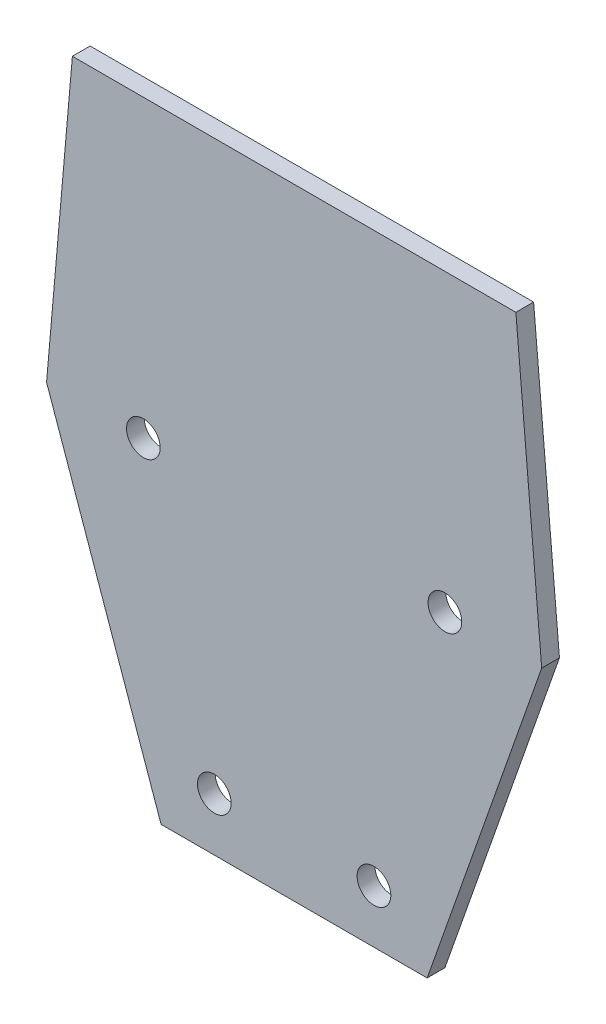
ISO-10303-21;
HEADER;
FILE_DESCRIPTION(('STEP AP214'),'2;1');
FILE_NAME('part.step','',(''),(''),'','','');
FILE_SCHEMA(('AUTOMOTIVE_DESIGN { 1 0 10303 214 1 1 1 1 }'));
ENDSEC;
DATA;
#1=APPLICATION_CONTEXT('core data for automotive mechanical design processes');
#2=APPLICATION_PROTOCOL_DEFINITION('international standard','automotive_design',2000,#1);
#3=PRODUCT_CONTEXT('',#1,'mechanical');
#4=PRODUCT('Part','Part','',(#3));
#5=PRODUCT_RELATED_PRODUCT_CATEGORY('part','',(#4));
#6=PRODUCT_DEFINITION_FORMATION('','',#4);
#7=PRODUCT_DEFINITION_CONTEXT('part definition',#1,'design');
#8=PRODUCT_DEFINITION('design','',#6,#7);
#9=PRODUCT_DEFINITION_SHAPE('','',#8);
#10=(LENGTH_UNIT() NAMED_UNIT(*) SI_UNIT(.MILLI.,.METRE.));
#11=(NAMED_UNIT(*) PLANE_ANGLE_UNIT() SI_UNIT($,.RADIAN.));
#12=(NAMED_UNIT(*) SI_UNIT($,.STERADIAN.) SOLID_ANGLE_UNIT());
#13=UNCERTAINTY_MEASURE_WITH_UNIT(LENGTH_MEASURE(1.E-05),#10,'distance_accuracy_value','');
#14=(GEOMETRIC_REPRESENTATION_CONTEXT(3) GLOBAL_UNCERTAINTY_ASSIGNED_CONTEXT((#13)) GLOBAL_UNIT_ASSIGNED_CONTEXT((#10,
#11,#12)) REPRESENTATION_CONTEXT('',''));
#15=CARTESIAN_POINT('',(0.,0.,0.));
#16=DIRECTION('',(0.,0.,1.));
#17=DIRECTION('',(1.,0.,0.));
#18=AXIS2_PLACEMENT_3D('',#15,#16,#17);
#19=CARTESIAN_POINT('',(-31.75,28.792017295859,2.54));
#20=DIRECTION('',(0.996194698091745,-0.087155742747662,0.));
#21=DIRECTION('',(0.087155742747662,0.996194698091745,0.));
#22=AXIS2_PLACEMENT_3D('',#19,#20,#21);
#23=PLANE('',#22);
#24=DIRECTION('',(-0.087155742747662,-0.996194698091745,0.));
#25=VECTOR('',#24,1.);
#26=CARTESIAN_POINT('',(-31.75,28.792017295859,0.));
#27=LINE('',#26,#25);
#28=CARTESIAN_POINT('',(-31.75,28.792017295859,0.));
#29=VERTEX_POINT('',#28);
#30=CARTESIAN_POINT('',(-35.4482854595529,-13.4795789373709,0.));
#31=VERTEX_POINT('',#30);
#32=EDGE_CURVE('E128',#29,#31,#27,.T.);
#33=ORIENTED_EDGE('',*,*,#32,.T.);
#34=DIRECTION('',(0.,0.,-1.));
#35=VECTOR('',#34,1.);
#36=CARTESIAN_POINT('',(-35.4482854595529,-13.4795789373709,2.54));
#37=LINE('',#36,#35);
#38=CARTESIAN_POINT('',(-35.4482854595529,-13.4795789373709,2.54));
#39=VERTEX_POINT('',#38);
#40=EDGE_CURVE('E11',#39,#31,#37,.T.);
#41=ORIENTED_EDGE('',*,*,#40,.F.);
#42=DIRECTION('',(-0.087155742747662,-0.996194698091745,0.));
#43=VECTOR('',#42,1.);
#44=CARTESIAN_POINT('',(-31.75,28.792017295859,2.54));
#45=LINE('',#44,#43);
#46=CARTESIAN_POINT('',(-31.75,28.792017295859,2.54));
#47=VERTEX_POINT('',#46);
#48=EDGE_CURVE('E149',#47,#39,#45,.T.);
#49=ORIENTED_EDGE('',*,*,#48,.F.);
#50=DIRECTION('',(0.,0.,-1.));
#51=VECTOR('',#50,1.);
#52=CARTESIAN_POINT('',(-31.75,28.792017295859,2.54));
#53=LINE('',#52,#51);
#54=EDGE_CURVE('E56',#47,#29,#53,.T.);
#55=ORIENTED_EDGE('',*,*,#54,.T.);
#56=EDGE_LOOP('',(#33,#41,#49,#55));
#57=FACE_BOUND('',#56,.T.);
#58=ADVANCED_FACE('F39',(#57),#23,.F.);
#59=CARTESIAN_POINT('',(-35.4482854595529,-13.4795789373709,2.54));
#60=DIRECTION('',(0.943363084419856,0.331762099935866,0.));
#61=DIRECTION('',(-0.331762099935867,0.943363084419856,0.));
#62=AXIS2_PLACEMENT_3D('',#59,#60,#61);
#63=PLANE('',#62);
#64=DIRECTION('',(0.331762099935866,-0.943363084419856,0.));
#65=VECTOR('',#64,1.);
#66=CARTESIAN_POINT('',(-35.4482854595529,-13.4795789373709,0.));
#67=LINE('',#66,#65);
#68=CARTESIAN_POINT('',(-19.05,-60.107982704141,0.));
#69=VERTEX_POINT('',#68);
#70=EDGE_CURVE('E131',#31,#69,#67,.T.);
#71=ORIENTED_EDGE('',*,*,#70,.T.);
#72=DIRECTION('',(0.,0.,-1.));
#73=VECTOR('',#72,1.);
#74=CARTESIAN_POINT('',(-19.05,-60.107982704141,2.54));
#75=LINE('',#74,#73);
#76=CARTESIAN_POINT('',(-19.05,-60.107982704141,2.54));
#77=VERTEX_POINT('',#76);
#78=EDGE_CURVE('E48',#77,#69,#75,.T.);
#79=ORIENTED_EDGE('',*,*,#78,.F.);
#80=DIRECTION('',(0.331762099935866,-0.943363084419856,0.));
#81=VECTOR('',#80,1.);
#82=CARTESIAN_POINT('',(-35.4482854595529,-13.4795789373709,2.54));
#83=LINE('',#82,#81);
#84=EDGE_CURVE('E88',#39,#77,#83,.T.);
#85=ORIENTED_EDGE('',*,*,#84,.F.);
#86=ORIENTED_EDGE('',*,*,#40,.T.);
#87=EDGE_LOOP('',(#71,#79,#85,#86));
#88=FACE_BOUND('',#87,.T.);
#89=ADVANCED_FACE('F159',(#88),#63,.F.);
#90=CARTESIAN_POINT('',(19.05,-60.107982704141,2.54));
#91=DIRECTION('',(0.,-1.,0.));
#92=DIRECTION('',(1.,0.,0.));
#93=AXIS2_PLACEMENT_3D('',#90,#91,#92);
#94=PLANE('',#93);
#95=DIRECTION('',(-1.,0.,0.));
#96=VECTOR('',#95,1.);
#97=CARTESIAN_POINT('',(19.05,-60.107982704141,0.));
#98=LINE('',#97,#96);
#99=CARTESIAN_POINT('',(19.05,-60.107982704141,0.));
#100=VERTEX_POINT('',#99);
#101=EDGE_CURVE('E136',#100,#69,#98,.T.);
#102=ORIENTED_EDGE('',*,*,#101,.F.);
#103=DIRECTION('',(0.,0.,-1.));
#104=VECTOR('',#103,1.);
#105=CARTESIAN_POINT('',(19.05,-60.107982704141,2.54));
#106=LINE('',#105,#104);
#107=CARTESIAN_POINT('',(19.05,-60.107982704141,2.54));
#108=VERTEX_POINT('',#107);
#109=EDGE_CURVE('E108',#108,#100,#106,.T.);
#110=ORIENTED_EDGE('',*,*,#109,.F.);
#111=DIRECTION('',(-1.,0.,0.));
#112=VECTOR('',#111,1.);
#113=CARTESIAN_POINT('',(19.05,-60.107982704141,2.54));
#114=LINE('',#113,#112);
#115=EDGE_CURVE('E117',#108,#77,#114,.T.);
#116=ORIENTED_EDGE('',*,*,#115,.T.);
#117=ORIENTED_EDGE('',*,*,#78,.T.);
#118=EDGE_LOOP('',(#102,#110,#116,#117));
#119=FACE_BOUND('',#118,.T.);
#120=ADVANCED_FACE('F158',(#119),#94,.T.);
#121=CARTESIAN_POINT('',(35.4482854595526,-13.4795789373709,2.54));
#122=DIRECTION('',(0.943363084419858,-0.331762099935861,0.));
#123=DIRECTION('',(0.331762099935861,0.943363084419858,0.));
#124=AXIS2_PLACEMENT_3D('',#121,#122,#123);
#125=PLANE('',#124);
#126=DIRECTION('',(-0.331762099935861,-0.943363084419858,0.));
#127=VECTOR('',#126,1.);
#128=CARTESIAN_POINT('',(35.4482854595526,-13.4795789373709,0.));
#129=LINE('',#128,#127);
#130=CARTESIAN_POINT('',(35.4482854595526,-13.4795789373709,0.));
#131=VERTEX_POINT('',#130);
#132=EDGE_CURVE('E103',#131,#100,#129,.T.);
#133=ORIENTED_EDGE('',*,*,#132,.F.);
#134=DIRECTION('',(0.,0.,-1.));
#135=VECTOR('',#134,1.);
#136=CARTESIAN_POINT('',(35.4482854595526,-13.4795789373709,2.54));
#137=LINE('',#136,#135);
#138=CARTESIAN_POINT('',(35.4482854595526,-13.4795789373709,2.54));
#139=VERTEX_POINT('',#138);
#140=EDGE_CURVE('E98',#139,#131,#137,.T.);
#141=ORIENTED_EDGE('',*,*,#140,.F.);
#142=DIRECTION('',(-0.331762099935861,-0.943363084419858,0.));
#143=VECTOR('',#142,1.);
#144=CARTESIAN_POINT('',(35.4482854595526,-13.4795789373709,2.54));
#145=LINE('',#144,#143);
#146=EDGE_CURVE('E101',#139,#108,#145,.T.);
#147=ORIENTED_EDGE('',*,*,#146,.T.);
#148=ORIENTED_EDGE('',*,*,#109,.T.);
#149=EDGE_LOOP('',(#133,#141,#147,#148));
#150=FACE_BOUND('',#149,.T.);
#151=ADVANCED_FACE('F100',(#150),#125,.T.);
#152=CARTESIAN_POINT('',(31.75,28.792017295859,2.54));
#153=DIRECTION('',(0.996194698091746,0.0871557427476547,0.));
#154=DIRECTION('',(-0.0871557427476547,0.996194698091746,0.));
#155=AXIS2_PLACEMENT_3D('',#152,#153,#154);
#156=PLANE('',#155);
#157=DIRECTION('',(0.0871557427476547,-0.996194698091746,0.));
#158=VECTOR('',#157,1.);
#159=CARTESIAN_POINT('',(31.75,28.792017295859,0.));
#160=LINE('',#159,#158);
#161=CARTESIAN_POINT('',(31.75,28.792017295859,0.));
#162=VERTEX_POINT('',#161);
#163=EDGE_CURVE('E142',#162,#131,#160,.T.);
#164=ORIENTED_EDGE('',*,*,#163,.F.);
#165=DIRECTION('',(0.,0.,-1.));
#166=VECTOR('',#165,1.);
#167=CARTESIAN_POINT('',(31.75,28.792017295859,2.54));
#168=LINE('',#167,#166);
#169=CARTESIAN_POINT('',(31.75,28.792017295859,2.54));
#170=VERTEX_POINT('',#169);
#171=EDGE_CURVE('E76',#170,#162,#168,.T.);
#172=ORIENTED_EDGE('',*,*,#171,.F.);
#173=DIRECTION('',(0.0871557427476547,-0.996194698091746,0.));
#174=VECTOR('',#173,1.);
#175=CARTESIAN_POINT('',(31.75,28.792017295859,2.54));
#176=LINE('',#175,#174);
#177=EDGE_CURVE('E115',#170,#139,#176,.T.);
#178=ORIENTED_EDGE('',*,*,#177,.T.);
#179=ORIENTED_EDGE('',*,*,#140,.T.);
#180=EDGE_LOOP('',(#164,#172,#178,#179));
#181=FACE_BOUND('',#180,.T.);
#182=ADVANCED_FACE('F120',(#181),#156,.T.);
#183=CARTESIAN_POINT('',(-31.75,28.792017295859,2.54));
#184=DIRECTION('',(0.,1.,0.));
#185=DIRECTION('',(0.,0.,1.));
#186=AXIS2_PLACEMENT_3D('',#183,#184,#185);
#187=PLANE('',#186);
#188=DIRECTION('',(1.,0.,0.));
#189=VECTOR('',#188,1.);
#190=CARTESIAN_POINT('',(-31.75,28.792017295859,0.));
#191=LINE('',#190,#189);
#192=EDGE_CURVE('E145',#29,#162,#191,.T.);
#193=ORIENTED_EDGE('',*,*,#192,.F.);
#194=ORIENTED_EDGE('',*,*,#54,.F.);
#195=DIRECTION('',(1.,0.,0.));
#196=VECTOR('',#195,1.);
#197=CARTESIAN_POINT('',(-31.75,28.792017295859,2.54));
#198=LINE('',#197,#196);
#199=EDGE_CURVE('E122',#47,#170,#198,.T.);
#200=ORIENTED_EDGE('',*,*,#199,.T.);
#201=ORIENTED_EDGE('',*,*,#171,.T.);
#202=EDGE_LOOP('',(#193,#194,#200,#201));
#203=FACE_BOUND('',#202,.T.);
#204=ADVANCED_FACE('F163',(#203),#187,.T.);
#205=CARTESIAN_POINT('',(0.,0.,2.54));
#206=DIRECTION('',(0.,0.,-1.));
#207=DIRECTION('',(-1.,0.,0.));
#208=AXIS2_PLACEMENT_3D('',#205,#206,#207);
#209=PLANE('',#208);
#210=CARTESIAN_POINT('',(21.59,-13.4795789373709,2.54));
#211=DIRECTION('',(0.,0.,-1.));
#212=DIRECTION('',(-1.,0.,0.));
#213=AXIS2_PLACEMENT_3D('',#210,#211,#212);
#214=CIRCLE('',#213,2.413);
#215=CARTESIAN_POINT('',(19.177,-13.4795789373709,2.54));
#216=VERTEX_POINT('',#215);
#217=EDGE_CURVE('E196',#216,#216,#214,.T.);
#218=ORIENTED_EDGE('',*,*,#217,.T.);
#219=EDGE_LOOP('',(#218));
#220=FACE_BOUND('',#219,.T.);
#221=CARTESIAN_POINT('',(-21.59,-13.4795789373709,2.54));
#222=DIRECTION('',(0.,0.,-1.));
#223=DIRECTION('',(-1.,0.,0.));
#224=AXIS2_PLACEMENT_3D('',#221,#222,#223);
#225=CIRCLE('',#224,2.413);
#226=CARTESIAN_POINT('',(-24.003,-13.4795789373709,2.54));
#227=VERTEX_POINT('',#226);
#228=EDGE_CURVE('E204',#227,#227,#225,.T.);
#229=ORIENTED_EDGE('',*,*,#228,.T.);
#230=EDGE_LOOP('',(#229));
#231=FACE_BOUND('',#230,.T.);
#232=CARTESIAN_POINT('',(11.43,-52.487982704141,2.54));
#233=DIRECTION('',(0.,0.,-1.));
#234=DIRECTION('',(-1.,0.,0.));
#235=AXIS2_PLACEMENT_3D('',#232,#233,#234);
#236=CIRCLE('',#235,2.413);
#237=CARTESIAN_POINT('',(9.01700000000001,-52.487982704141,2.54));
#238=VERTEX_POINT('',#237);
#239=EDGE_CURVE('E188',#238,#238,#236,.T.);
#240=ORIENTED_EDGE('',*,*,#239,.T.);
#241=EDGE_LOOP('',(#240));
#242=FACE_BOUND('',#241,.T.);
#243=CARTESIAN_POINT('',(-11.43,-52.487982704141,2.54));
#244=DIRECTION('',(0.,0.,-1.));
#245=DIRECTION('',(-1.,0.,0.));
#246=AXIS2_PLACEMENT_3D('',#243,#244,#245);
#247=CIRCLE('',#246,2.413);
#248=CARTESIAN_POINT('',(-13.843,-52.487982704141,2.54));
#249=VERTEX_POINT('',#248);
#250=EDGE_CURVE('E132',#249,#249,#247,.T.);
#251=ORIENTED_EDGE('',*,*,#250,.T.);
#252=EDGE_LOOP('',(#251));
#253=FACE_BOUND('',#252,.T.);
#254=ORIENTED_EDGE('',*,*,#48,.T.);
#255=ORIENTED_EDGE('',*,*,#84,.T.);
#256=ORIENTED_EDGE('',*,*,#115,.F.);
#257=ORIENTED_EDGE('',*,*,#146,.F.);
#258=ORIENTED_EDGE('',*,*,#177,.F.);
#259=ORIENTED_EDGE('',*,*,#199,.F.);
#260=EDGE_LOOP('',(#254,#255,#256,#257,#258,#259));
#261=FACE_BOUND('',#260,.T.);
#262=ADVANCED_FACE('F113',(#220,#231,#242,#253,#261),#209,.F.);
#263=CARTESIAN_POINT('',(0.,0.,0.));
#264=DIRECTION('',(0.,0.,-1.));
#265=DIRECTION('',(-1.,0.,0.));
#266=AXIS2_PLACEMENT_3D('',#263,#264,#265);
#267=PLANE('',#266);
#268=CARTESIAN_POINT('',(21.59,-13.4795789373709,0.));
#269=DIRECTION('',(0.,0.,-1.));
#270=DIRECTION('',(-1.,0.,0.));
#271=AXIS2_PLACEMENT_3D('',#268,#269,#270);
#272=CIRCLE('',#271,2.413);
#273=CARTESIAN_POINT('',(19.177,-13.4795789373709,0.));
#274=VERTEX_POINT('',#273);
#275=EDGE_CURVE('E192',#274,#274,#272,.T.);
#276=ORIENTED_EDGE('',*,*,#275,.F.);
#277=EDGE_LOOP('',(#276));
#278=FACE_BOUND('',#277,.T.);
#279=CARTESIAN_POINT('',(-21.59,-13.4795789373709,0.));
#280=DIRECTION('',(0.,0.,-1.));
#281=DIRECTION('',(-1.,0.,0.));
#282=AXIS2_PLACEMENT_3D('',#279,#280,#281);
#283=CIRCLE('',#282,2.413);
#284=CARTESIAN_POINT('',(-24.003,-13.4795789373709,0.));
#285=VERTEX_POINT('',#284);
#286=EDGE_CURVE('E200',#285,#285,#283,.T.);
#287=ORIENTED_EDGE('',*,*,#286,.F.);
#288=EDGE_LOOP('',(#287));
#289=FACE_BOUND('',#288,.T.);
#290=CARTESIAN_POINT('',(11.43,-52.487982704141,0.));
#291=DIRECTION('',(0.,0.,-1.));
#292=DIRECTION('',(-1.,0.,0.));
#293=AXIS2_PLACEMENT_3D('',#290,#291,#292);
#294=CIRCLE('',#293,2.413);
#295=CARTESIAN_POINT('',(9.01700000000001,-52.487982704141,0.));
#296=VERTEX_POINT('',#295);
#297=EDGE_CURVE('E208',#296,#296,#294,.T.);
#298=ORIENTED_EDGE('',*,*,#297,.F.);
#299=EDGE_LOOP('',(#298));
#300=FACE_BOUND('',#299,.T.);
#301=CARTESIAN_POINT('',(-11.43,-52.487982704141,0.));
#302=DIRECTION('',(0.,0.,-1.));
#303=DIRECTION('',(-1.,0.,0.));
#304=AXIS2_PLACEMENT_3D('',#301,#302,#303);
#305=CIRCLE('',#304,2.413);
#306=CARTESIAN_POINT('',(-13.843,-52.487982704141,0.));
#307=VERTEX_POINT('',#306);
#308=EDGE_CURVE('E183',#307,#307,#305,.T.);
#309=ORIENTED_EDGE('',*,*,#308,.F.);
#310=EDGE_LOOP('',(#309));
#311=FACE_BOUND('',#310,.T.);
#312=ORIENTED_EDGE('',*,*,#32,.F.);
#313=ORIENTED_EDGE('',*,*,#192,.T.);
#314=ORIENTED_EDGE('',*,*,#163,.T.);
#315=ORIENTED_EDGE('',*,*,#132,.T.);
#316=ORIENTED_EDGE('',*,*,#101,.T.);
#317=ORIENTED_EDGE('',*,*,#70,.F.);
#318=EDGE_LOOP('',(#312,#313,#314,#315,#316,#317));
#319=FACE_BOUND('',#318,.T.);
#320=ADVANCED_FACE('F162',(#278,#289,#300,#311,#319),#267,.T.);
#321=CARTESIAN_POINT('',(-11.43,-52.487982704141,2.54));
#322=DIRECTION('',(0.,0.,-1.));
#323=DIRECTION('',(-1.,0.,0.));
#324=AXIS2_PLACEMENT_3D('',#321,#322,#323);
#325=CYLINDRICAL_SURFACE('',#324,2.413);
#326=ORIENTED_EDGE('',*,*,#250,.F.);
#327=EDGE_LOOP('',(#326));
#328=FACE_BOUND('',#327,.T.);
#329=ORIENTED_EDGE('',*,*,#308,.T.);
#330=EDGE_LOOP('',(#329));
#331=FACE_BOUND('',#330,.T.);
#332=ADVANCED_FACE('F222',(#328,#331),#325,.F.);
#333=CARTESIAN_POINT('',(11.43,-52.487982704141,2.54));
#334=DIRECTION('',(0.,0.,-1.));
#335=DIRECTION('',(-1.,0.,0.));
#336=AXIS2_PLACEMENT_3D('',#333,#334,#335);
#337=CYLINDRICAL_SURFACE('',#336,2.413);
#338=ORIENTED_EDGE('',*,*,#239,.F.);
#339=EDGE_LOOP('',(#338));
#340=FACE_BOUND('',#339,.T.);
#341=ORIENTED_EDGE('',*,*,#297,.T.);
#342=EDGE_LOOP('',(#341));
#343=FACE_BOUND('',#342,.T.);
#344=ADVANCED_FACE('F218',(#340,#343),#337,.F.);
#345=CARTESIAN_POINT('',(-21.59,-13.4795789373709,2.54));
#346=DIRECTION('',(0.,0.,-1.));
#347=DIRECTION('',(-1.,0.,0.));
#348=AXIS2_PLACEMENT_3D('',#345,#346,#347);
#349=CYLINDRICAL_SURFACE('',#348,2.413);
#350=ORIENTED_EDGE('',*,*,#228,.F.);
#351=EDGE_LOOP('',(#350));
#352=FACE_BOUND('',#351,.T.);
#353=ORIENTED_EDGE('',*,*,#286,.T.);
#354=EDGE_LOOP('',(#353));
#355=FACE_BOUND('',#354,.T.);
#356=ADVANCED_FACE('F221',(#352,#355),#349,.F.);
#357=CARTESIAN_POINT('',(21.59,-13.4795789373709,2.54));
#358=DIRECTION('',(0.,0.,-1.));
#359=DIRECTION('',(-1.,0.,0.));
#360=AXIS2_PLACEMENT_3D('',#357,#358,#359);
#361=CYLINDRICAL_SURFACE('',#360,2.413);
#362=ORIENTED_EDGE('',*,*,#217,.F.);
#363=EDGE_LOOP('',(#362));
#364=FACE_BOUND('',#363,.T.);
#365=ORIENTED_EDGE('',*,*,#275,.T.);
#366=EDGE_LOOP('',(#365));
#367=FACE_BOUND('',#366,.T.);
#368=ADVANCED_FACE('F238',(#364,#367),#361,.F.);
#369=CLOSED_SHELL('',(#58,#89,#120,#151,#182,#204,#262,#320,#332,#344,#356,#368));
#370=MANIFOLD_SOLID_BREP('B2',#369);
#371=ADVANCED_BREP_SHAPE_REPRESENTATION('',(#18,#370),#14);
#372=SHAPE_DEFINITION_REPRESENTATION(#9,#371);
ENDSEC;
END-ISO-10303-21;
